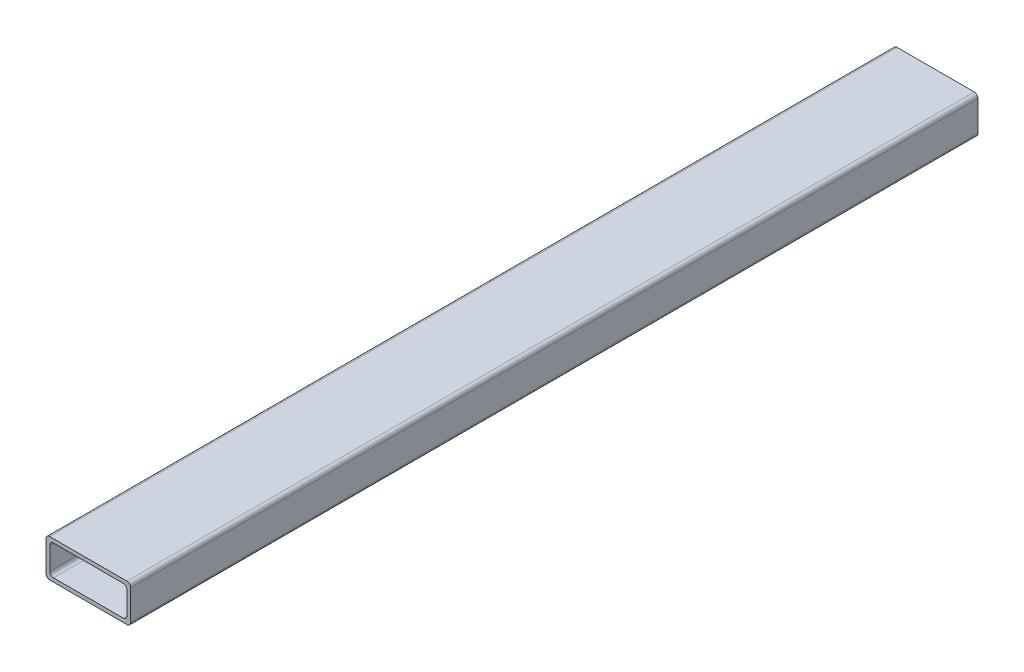
ISO-10303-21;
HEADER;
FILE_DESCRIPTION(('STEP AP214'),'2;1');
FILE_NAME('part.step','',(''),(''),'','','');
FILE_SCHEMA(('AUTOMOTIVE_DESIGN { 1 0 10303 214 1 1 1 1 }'));
ENDSEC;
DATA;
#1=APPLICATION_CONTEXT('core data for automotive mechanical design processes');
#2=APPLICATION_PROTOCOL_DEFINITION('international standard','automotive_design',2000,#1);
#3=PRODUCT_CONTEXT('',#1,'mechanical');
#4=PRODUCT('Part','Part','',(#3));
#5=PRODUCT_RELATED_PRODUCT_CATEGORY('part','',(#4));
#6=PRODUCT_DEFINITION_FORMATION('','',#4);
#7=PRODUCT_DEFINITION_CONTEXT('part definition',#1,'design');
#8=PRODUCT_DEFINITION('design','',#6,#7);
#9=PRODUCT_DEFINITION_SHAPE('','',#8);
#10=(LENGTH_UNIT() NAMED_UNIT(*) SI_UNIT(.MILLI.,.METRE.));
#11=(NAMED_UNIT(*) PLANE_ANGLE_UNIT() SI_UNIT($,.RADIAN.));
#12=(NAMED_UNIT(*) SI_UNIT($,.STERADIAN.) SOLID_ANGLE_UNIT());
#13=UNCERTAINTY_MEASURE_WITH_UNIT(LENGTH_MEASURE(1.E-05),#10,'distance_accuracy_value','');
#14=(GEOMETRIC_REPRESENTATION_CONTEXT(3) GLOBAL_UNCERTAINTY_ASSIGNED_CONTEXT((#13)) GLOBAL_UNIT_ASSIGNED_CONTEXT((#10,
#11,#12)) REPRESENTATION_CONTEXT('',''));
#15=CARTESIAN_POINT('',(0.,0.,0.));
#16=DIRECTION('',(0.,0.,1.));
#17=DIRECTION('',(1.,0.,0.));
#18=AXIS2_PLACEMENT_3D('',#15,#16,#17);
#19=CARTESIAN_POINT('',(-67.0781194232168,25.7326253085691,450.));
#20=DIRECTION('',(0.,0.,1.));
#21=DIRECTION('',(1.,0.,0.));
#22=AXIS2_PLACEMENT_3D('',#19,#20,#21);
#23=PLANE('',#22);
#24=CARTESIAN_POINT('',(-67.0781194232168,25.7326253085691,450.));
#25=DIRECTION('',(0.,0.,1.));
#26=DIRECTION('',(1.,0.,0.));
#27=AXIS2_PLACEMENT_3D('',#24,#25,#26);
#28=CIRCLE('',#27,2.);
#29=CARTESIAN_POINT('',(-67.0781194232168,27.7326253085691,450.));
#30=VERTEX_POINT('',#29);
#31=CARTESIAN_POINT('',(-69.0781194232168,25.7326253085691,450.));
#32=VERTEX_POINT('',#31);
#33=EDGE_CURVE('E195',#30,#32,#28,.T.);
#34=ORIENTED_EDGE('',*,*,#33,.T.);
#35=DIRECTION('',(0.,-1.,0.));
#36=VECTOR('',#35,1.);
#37=CARTESIAN_POINT('',(-69.0781194232168,9.73262530856907,450.));
#38=LINE('',#37,#36);
#39=CARTESIAN_POINT('',(-69.0781194232168,9.73262530856907,450.));
#40=VERTEX_POINT('',#39);
#41=EDGE_CURVE('E198',#32,#40,#38,.T.);
#42=ORIENTED_EDGE('',*,*,#41,.T.);
#43=CARTESIAN_POINT('',(-67.0781194232168,9.73262530856905,450.));
#44=DIRECTION('',(0.,0.,1.));
#45=DIRECTION('',(1.,0.,0.));
#46=AXIS2_PLACEMENT_3D('',#43,#44,#45);
#47=CIRCLE('',#46,2.);
#48=CARTESIAN_POINT('',(-67.0781194232168,7.73262530856905,450.));
#49=VERTEX_POINT('',#48);
#50=EDGE_CURVE('E201',#40,#49,#47,.T.);
#51=ORIENTED_EDGE('',*,*,#50,.T.);
#52=DIRECTION('',(1.,0.,0.));
#53=VECTOR('',#52,1.);
#54=CARTESIAN_POINT('',(-67.0781194232168,7.73262530856905,450.));
#55=LINE('',#54,#53);
#56=CARTESIAN_POINT('',(-26.0781194232168,7.73262530856905,450.));
#57=VERTEX_POINT('',#56);
#58=EDGE_CURVE('E203',#49,#57,#55,.T.);
#59=ORIENTED_EDGE('',*,*,#58,.T.);
#60=CARTESIAN_POINT('',(-26.0781194232168,9.73262530856905,450.));
#61=DIRECTION('',(0.,0.,1.));
#62=DIRECTION('',(1.,0.,0.));
#63=AXIS2_PLACEMENT_3D('',#60,#61,#62);
#64=CIRCLE('',#63,2.);
#65=CARTESIAN_POINT('',(-24.0781194232168,9.73262530856907,450.));
#66=VERTEX_POINT('',#65);
#67=EDGE_CURVE('E205',#57,#66,#64,.T.);
#68=ORIENTED_EDGE('',*,*,#67,.T.);
#69=DIRECTION('',(0.,1.,0.));
#70=VECTOR('',#69,1.);
#71=CARTESIAN_POINT('',(-24.0781194232168,25.7326253085691,450.));
#72=LINE('',#71,#70);
#73=CARTESIAN_POINT('',(-24.0781194232168,25.7326253085691,450.));
#74=VERTEX_POINT('',#73);
#75=EDGE_CURVE('E207',#66,#74,#72,.T.);
#76=ORIENTED_EDGE('',*,*,#75,.T.);
#77=CARTESIAN_POINT('',(-26.0781194232168,25.7326253085691,450.));
#78=DIRECTION('',(0.,0.,1.));
#79=DIRECTION('',(1.,0.,0.));
#80=AXIS2_PLACEMENT_3D('',#77,#78,#79);
#81=CIRCLE('',#80,2.);
#82=CARTESIAN_POINT('',(-26.0781194232168,27.7326253085691,450.));
#83=VERTEX_POINT('',#82);
#84=EDGE_CURVE('E209',#74,#83,#81,.T.);
#85=ORIENTED_EDGE('',*,*,#84,.T.);
#86=DIRECTION('',(-1.,0.,0.));
#87=VECTOR('',#86,1.);
#88=CARTESIAN_POINT('',(-67.0781194232168,27.7326253085691,450.));
#89=LINE('',#88,#87);
#90=EDGE_CURVE('E211',#83,#30,#89,.T.);
#91=ORIENTED_EDGE('',*,*,#90,.T.);
#92=EDGE_LOOP('',(#34,#42,#51,#59,#68,#76,#85,#91));
#93=FACE_BOUND('',#92,.T.);
#94=DIRECTION('',(0.,-1.,0.));
#95=VECTOR('',#94,1.);
#96=CARTESIAN_POINT('',(-67.0781194232168,11.7326253085691,450.));
#97=LINE('',#96,#95);
#98=CARTESIAN_POINT('',(-67.0781194232168,23.7326253085691,450.));
#99=VERTEX_POINT('',#98);
#100=CARTESIAN_POINT('',(-67.0781194232168,11.7326253085691,450.));
#101=VERTEX_POINT('',#100);
#102=EDGE_CURVE('E138',#99,#101,#97,.T.);
#103=ORIENTED_EDGE('',*,*,#102,.F.);
#104=CARTESIAN_POINT('',(-65.0781194232168,23.7326253085691,450.));
#105=DIRECTION('',(0.,0.,1.));
#106=DIRECTION('',(1.,0.,0.));
#107=AXIS2_PLACEMENT_3D('',#104,#105,#106);
#108=CIRCLE('',#107,2.);
#109=CARTESIAN_POINT('',(-65.0781194232168,25.7326253085691,450.));
#110=VERTEX_POINT('',#109);
#111=EDGE_CURVE('E130',#110,#99,#108,.T.);
#112=ORIENTED_EDGE('',*,*,#111,.F.);
#113=DIRECTION('',(-1.,0.,0.));
#114=VECTOR('',#113,1.);
#115=CARTESIAN_POINT('',(-65.0781194232168,25.7326253085691,450.));
#116=LINE('',#115,#114);
#117=CARTESIAN_POINT('',(-28.0781194232168,25.7326253085691,450.));
#118=VERTEX_POINT('',#117);
#119=EDGE_CURVE('E163',#118,#110,#116,.T.);
#120=ORIENTED_EDGE('',*,*,#119,.F.);
#121=CARTESIAN_POINT('',(-28.0781194232168,23.7326253085691,450.));
#122=DIRECTION('',(0.,0.,1.));
#123=DIRECTION('',(1.,0.,0.));
#124=AXIS2_PLACEMENT_3D('',#121,#122,#123);
#125=CIRCLE('',#124,2.);
#126=CARTESIAN_POINT('',(-26.0781194232168,23.7326253085691,450.));
#127=VERTEX_POINT('',#126);
#128=EDGE_CURVE('E161',#127,#118,#125,.T.);
#129=ORIENTED_EDGE('',*,*,#128,.F.);
#130=DIRECTION('',(0.,1.,0.));
#131=VECTOR('',#130,1.);
#132=CARTESIAN_POINT('',(-26.0781194232168,23.7326253085691,450.));
#133=LINE('',#132,#131);
#134=CARTESIAN_POINT('',(-26.0781194232168,11.7326253085691,450.));
#135=VERTEX_POINT('',#134);
#136=EDGE_CURVE('E159',#135,#127,#133,.T.);
#137=ORIENTED_EDGE('',*,*,#136,.F.);
#138=CARTESIAN_POINT('',(-28.0781194232168,11.732625308569,450.));
#139=DIRECTION('',(0.,0.,1.));
#140=DIRECTION('',(1.,0.,0.));
#141=AXIS2_PLACEMENT_3D('',#138,#139,#140);
#142=CIRCLE('',#141,2.);
#143=CARTESIAN_POINT('',(-28.0781194232168,9.73262530856905,450.));
#144=VERTEX_POINT('',#143);
#145=EDGE_CURVE('E157',#144,#135,#142,.T.);
#146=ORIENTED_EDGE('',*,*,#145,.F.);
#147=DIRECTION('',(1.,0.,0.));
#148=VECTOR('',#147,1.);
#149=CARTESIAN_POINT('',(-65.0781194232168,9.73262530856905,450.));
#150=LINE('',#149,#148);
#151=CARTESIAN_POINT('',(-65.0781194232168,9.73262530856905,450.));
#152=VERTEX_POINT('',#151);
#153=EDGE_CURVE('E153',#152,#144,#150,.T.);
#154=ORIENTED_EDGE('',*,*,#153,.F.);
#155=CARTESIAN_POINT('',(-65.0781194232168,11.732625308569,450.));
#156=DIRECTION('',(0.,0.,1.));
#157=DIRECTION('',(1.,0.,0.));
#158=AXIS2_PLACEMENT_3D('',#155,#156,#157);
#159=CIRCLE('',#158,2.);
#160=EDGE_CURVE('E151',#101,#152,#159,.T.);
#161=ORIENTED_EDGE('',*,*,#160,.F.);
#162=EDGE_LOOP('',(#103,#112,#120,#129,#137,#146,#154,#161));
#163=FACE_BOUND('',#162,.T.);
#164=ADVANCED_FACE('F17',(#93,#163),#23,.T.);
#165=CARTESIAN_POINT('',(-67.0781194232168,25.7326253085691,0.));
#166=DIRECTION('',(0.,0.,1.));
#167=DIRECTION('',(1.,0.,0.));
#168=AXIS2_PLACEMENT_3D('',#165,#166,#167);
#169=PLANE('',#168);
#170=CARTESIAN_POINT('',(-67.0781194232168,25.7326253085691,0.));
#171=DIRECTION('',(0.,0.,1.));
#172=DIRECTION('',(1.,0.,0.));
#173=AXIS2_PLACEMENT_3D('',#170,#171,#172);
#174=CIRCLE('',#173,2.);
#175=CARTESIAN_POINT('',(-67.0781194232168,27.7326253085691,0.));
#176=VERTEX_POINT('',#175);
#177=CARTESIAN_POINT('',(-69.0781194232168,25.7326253085691,0.));
#178=VERTEX_POINT('',#177);
#179=EDGE_CURVE('E146',#176,#178,#174,.T.);
#180=ORIENTED_EDGE('',*,*,#179,.F.);
#181=DIRECTION('',(-1.,0.,0.));
#182=VECTOR('',#181,1.);
#183=CARTESIAN_POINT('',(-67.0781194232168,27.7326253085691,0.));
#184=LINE('',#183,#182);
#185=CARTESIAN_POINT('',(-26.0781194232168,27.7326253085691,0.));
#186=VERTEX_POINT('',#185);
#187=EDGE_CURVE('E199',#186,#176,#184,.T.);
#188=ORIENTED_EDGE('',*,*,#187,.F.);
#189=CARTESIAN_POINT('',(-26.0781194232168,25.7326253085691,0.));
#190=DIRECTION('',(0.,0.,1.));
#191=DIRECTION('',(1.,0.,0.));
#192=AXIS2_PLACEMENT_3D('',#189,#190,#191);
#193=CIRCLE('',#192,2.);
#194=CARTESIAN_POINT('',(-24.0781194232168,25.7326253085691,0.));
#195=VERTEX_POINT('',#194);
#196=EDGE_CURVE('E226',#195,#186,#193,.T.);
#197=ORIENTED_EDGE('',*,*,#196,.F.);
#198=DIRECTION('',(0.,1.,0.));
#199=VECTOR('',#198,1.);
#200=CARTESIAN_POINT('',(-24.0781194232168,25.7326253085691,0.));
#201=LINE('',#200,#199);
#202=CARTESIAN_POINT('',(-24.0781194232168,9.73262530856907,0.));
#203=VERTEX_POINT('',#202);
#204=EDGE_CURVE('E224',#203,#195,#201,.T.);
#205=ORIENTED_EDGE('',*,*,#204,.F.);
#206=CARTESIAN_POINT('',(-26.0781194232168,9.73262530856905,0.));
#207=DIRECTION('',(0.,0.,1.));
#208=DIRECTION('',(1.,0.,0.));
#209=AXIS2_PLACEMENT_3D('',#206,#207,#208);
#210=CIRCLE('',#209,2.);
#211=CARTESIAN_POINT('',(-26.0781194232168,7.73262530856905,0.));
#212=VERTEX_POINT('',#211);
#213=EDGE_CURVE('E222',#212,#203,#210,.T.);
#214=ORIENTED_EDGE('',*,*,#213,.F.);
#215=DIRECTION('',(1.,0.,0.));
#216=VECTOR('',#215,1.);
#217=CARTESIAN_POINT('',(-67.0781194232168,7.73262530856905,0.));
#218=LINE('',#217,#216);
#219=CARTESIAN_POINT('',(-67.0781194232168,7.73262530856905,0.));
#220=VERTEX_POINT('',#219);
#221=EDGE_CURVE('E220',#220,#212,#218,.T.);
#222=ORIENTED_EDGE('',*,*,#221,.F.);
#223=CARTESIAN_POINT('',(-67.0781194232168,9.73262530856905,0.));
#224=DIRECTION('',(0.,0.,1.));
#225=DIRECTION('',(1.,0.,0.));
#226=AXIS2_PLACEMENT_3D('',#223,#224,#225);
#227=CIRCLE('',#226,2.);
#228=CARTESIAN_POINT('',(-69.0781194232168,9.73262530856907,0.));
#229=VERTEX_POINT('',#228);
#230=EDGE_CURVE('E218',#229,#220,#227,.T.);
#231=ORIENTED_EDGE('',*,*,#230,.F.);
#232=DIRECTION('',(0.,-1.,0.));
#233=VECTOR('',#232,1.);
#234=CARTESIAN_POINT('',(-69.0781194232168,9.73262530856907,0.));
#235=LINE('',#234,#233);
#236=EDGE_CURVE('E216',#178,#229,#235,.T.);
#237=ORIENTED_EDGE('',*,*,#236,.F.);
#238=EDGE_LOOP('',(#180,#188,#197,#205,#214,#222,#231,#237));
#239=FACE_BOUND('',#238,.T.);
#240=CARTESIAN_POINT('',(-65.0781194232168,23.7326253085691,0.));
#241=DIRECTION('',(0.,0.,1.));
#242=DIRECTION('',(1.,0.,0.));
#243=AXIS2_PLACEMENT_3D('',#240,#241,#242);
#244=CIRCLE('',#243,2.);
#245=CARTESIAN_POINT('',(-65.0781194232168,25.7326253085691,0.));
#246=VERTEX_POINT('',#245);
#247=CARTESIAN_POINT('',(-67.0781194232168,23.7326253085691,0.));
#248=VERTEX_POINT('',#247);
#249=EDGE_CURVE('E40',#246,#248,#244,.T.);
#250=ORIENTED_EDGE('',*,*,#249,.T.);
#251=DIRECTION('',(0.,-1.,0.));
#252=VECTOR('',#251,1.);
#253=CARTESIAN_POINT('',(-67.0781194232168,11.7326253085691,0.));
#254=LINE('',#253,#252);
#255=CARTESIAN_POINT('',(-67.0781194232168,11.7326253085691,0.));
#256=VERTEX_POINT('',#255);
#257=EDGE_CURVE('E145',#248,#256,#254,.T.);
#258=ORIENTED_EDGE('',*,*,#257,.T.);
#259=CARTESIAN_POINT('',(-65.0781194232168,11.732625308569,0.));
#260=DIRECTION('',(0.,0.,1.));
#261=DIRECTION('',(1.,0.,0.));
#262=AXIS2_PLACEMENT_3D('',#259,#260,#261);
#263=CIRCLE('',#262,2.);
#264=CARTESIAN_POINT('',(-65.0781194232168,9.73262530856905,0.));
#265=VERTEX_POINT('',#264);
#266=EDGE_CURVE('E167',#256,#265,#263,.T.);
#267=ORIENTED_EDGE('',*,*,#266,.T.);
#268=DIRECTION('',(1.,0.,0.));
#269=VECTOR('',#268,1.);
#270=CARTESIAN_POINT('',(-65.0781194232168,9.73262530856905,0.));
#271=LINE('',#270,#269);
#272=CARTESIAN_POINT('',(-28.0781194232168,9.73262530856905,0.));
#273=VERTEX_POINT('',#272);
#274=EDGE_CURVE('E170',#265,#273,#271,.T.);
#275=ORIENTED_EDGE('',*,*,#274,.T.);
#276=CARTESIAN_POINT('',(-28.0781194232168,11.732625308569,0.));
#277=DIRECTION('',(0.,0.,1.));
#278=DIRECTION('',(1.,0.,0.));
#279=AXIS2_PLACEMENT_3D('',#276,#277,#278);
#280=CIRCLE('',#279,2.);
#281=CARTESIAN_POINT('',(-26.0781194232168,11.7326253085691,0.));
#282=VERTEX_POINT('',#281);
#283=EDGE_CURVE('E173',#273,#282,#280,.T.);
#284=ORIENTED_EDGE('',*,*,#283,.T.);
#285=DIRECTION('',(0.,1.,0.));
#286=VECTOR('',#285,1.);
#287=CARTESIAN_POINT('',(-26.0781194232168,23.7326253085691,0.));
#288=LINE('',#287,#286);
#289=CARTESIAN_POINT('',(-26.0781194232168,23.7326253085691,0.));
#290=VERTEX_POINT('',#289);
#291=EDGE_CURVE('E176',#282,#290,#288,.T.);
#292=ORIENTED_EDGE('',*,*,#291,.T.);
#293=CARTESIAN_POINT('',(-28.0781194232168,23.7326253085691,0.));
#294=DIRECTION('',(0.,0.,1.));
#295=DIRECTION('',(1.,0.,0.));
#296=AXIS2_PLACEMENT_3D('',#293,#294,#295);
#297=CIRCLE('',#296,2.);
#298=CARTESIAN_POINT('',(-28.0781194232168,25.7326253085691,0.));
#299=VERTEX_POINT('',#298);
#300=EDGE_CURVE('E179',#290,#299,#297,.T.);
#301=ORIENTED_EDGE('',*,*,#300,.T.);
#302=DIRECTION('',(-1.,0.,0.));
#303=VECTOR('',#302,1.);
#304=CARTESIAN_POINT('',(-65.0781194232168,25.7326253085691,0.));
#305=LINE('',#304,#303);
#306=EDGE_CURVE('E139',#299,#246,#305,.T.);
#307=ORIENTED_EDGE('',*,*,#306,.T.);
#308=EDGE_LOOP('',(#250,#258,#267,#275,#284,#292,#301,#307));
#309=FACE_BOUND('',#308,.T.);
#310=ADVANCED_FACE('F256',(#239,#309),#169,.F.);
#311=CARTESIAN_POINT('',(-67.0781194232168,25.7326253085691,450.));
#312=DIRECTION('',(0.,0.,-1.));
#313=DIRECTION('',(-1.,0.,0.));
#314=AXIS2_PLACEMENT_3D('',#311,#312,#313);
#315=CYLINDRICAL_SURFACE('',#314,2.);
#316=ORIENTED_EDGE('',*,*,#179,.T.);
#317=DIRECTION('',(0.,0.,-1.));
#318=VECTOR('',#317,1.);
#319=CARTESIAN_POINT('',(-69.0781194232168,25.7326253085691,450.));
#320=LINE('',#319,#318);
#321=EDGE_CURVE('E11',#32,#178,#320,.T.);
#322=ORIENTED_EDGE('',*,*,#321,.F.);
#323=ORIENTED_EDGE('',*,*,#33,.F.);
#324=DIRECTION('',(0.,0.,-1.));
#325=VECTOR('',#324,1.);
#326=CARTESIAN_POINT('',(-67.0781194232168,27.7326253085691,450.));
#327=LINE('',#326,#325);
#328=EDGE_CURVE('E213',#30,#176,#327,.T.);
#329=ORIENTED_EDGE('',*,*,#328,.T.);
#330=EDGE_LOOP('',(#316,#322,#323,#329));
#331=FACE_BOUND('',#330,.T.);
#332=ADVANCED_FACE('F19',(#331),#315,.T.);
#333=CARTESIAN_POINT('',(-69.0781194232168,9.73262530856907,450.));
#334=DIRECTION('',(1.,0.,0.));
#335=DIRECTION('',(0.,0.,-1.));
#336=AXIS2_PLACEMENT_3D('',#333,#334,#335);
#337=PLANE('',#336);
#338=ORIENTED_EDGE('',*,*,#236,.T.);
#339=DIRECTION('',(0.,0.,-1.));
#340=VECTOR('',#339,1.);
#341=CARTESIAN_POINT('',(-69.0781194232168,9.73262530856907,450.));
#342=LINE('',#341,#340);
#343=EDGE_CURVE('E25',#40,#229,#342,.T.);
#344=ORIENTED_EDGE('',*,*,#343,.F.);
#345=ORIENTED_EDGE('',*,*,#41,.F.);
#346=ORIENTED_EDGE('',*,*,#321,.T.);
#347=EDGE_LOOP('',(#338,#344,#345,#346));
#348=FACE_BOUND('',#347,.T.);
#349=ADVANCED_FACE('F273',(#348),#337,.F.);
#350=CARTESIAN_POINT('',(-67.0781194232168,9.73262530856905,450.));
#351=DIRECTION('',(0.,0.,-1.));
#352=DIRECTION('',(-1.,0.,0.));
#353=AXIS2_PLACEMENT_3D('',#350,#351,#352);
#354=CYLINDRICAL_SURFACE('',#353,2.);
#355=ORIENTED_EDGE('',*,*,#230,.T.);
#356=DIRECTION('',(0.,0.,-1.));
#357=VECTOR('',#356,1.);
#358=CARTESIAN_POINT('',(-67.0781194232168,7.73262530856905,450.));
#359=LINE('',#358,#357);
#360=EDGE_CURVE('E243',#49,#220,#359,.T.);
#361=ORIENTED_EDGE('',*,*,#360,.F.);
#362=ORIENTED_EDGE('',*,*,#50,.F.);
#363=ORIENTED_EDGE('',*,*,#343,.T.);
#364=EDGE_LOOP('',(#355,#361,#362,#363));
#365=FACE_BOUND('',#364,.T.);
#366=ADVANCED_FACE('F250',(#365),#354,.T.);
#367=CARTESIAN_POINT('',(-67.0781194232168,7.73262530856905,450.));
#368=DIRECTION('',(0.,1.,0.));
#369=DIRECTION('',(0.,0.,1.));
#370=AXIS2_PLACEMENT_3D('',#367,#368,#369);
#371=PLANE('',#370);
#372=ORIENTED_EDGE('',*,*,#221,.T.);
#373=DIRECTION('',(0.,0.,-1.));
#374=VECTOR('',#373,1.);
#375=CARTESIAN_POINT('',(-26.0781194232168,7.73262530856905,450.));
#376=LINE('',#375,#374);
#377=EDGE_CURVE('E240',#57,#212,#376,.T.);
#378=ORIENTED_EDGE('',*,*,#377,.F.);
#379=ORIENTED_EDGE('',*,*,#58,.F.);
#380=ORIENTED_EDGE('',*,*,#360,.T.);
#381=EDGE_LOOP('',(#372,#378,#379,#380));
#382=FACE_BOUND('',#381,.T.);
#383=ADVANCED_FACE('F262',(#382),#371,.F.);
#384=CARTESIAN_POINT('',(-26.0781194232168,9.73262530856905,450.));
#385=DIRECTION('',(0.,0.,-1.));
#386=DIRECTION('',(-1.,0.,0.));
#387=AXIS2_PLACEMENT_3D('',#384,#385,#386);
#388=CYLINDRICAL_SURFACE('',#387,2.);
#389=ORIENTED_EDGE('',*,*,#213,.T.);
#390=DIRECTION('',(0.,0.,-1.));
#391=VECTOR('',#390,1.);
#392=CARTESIAN_POINT('',(-24.0781194232168,9.73262530856907,450.));
#393=LINE('',#392,#391);
#394=EDGE_CURVE('E237',#66,#203,#393,.T.);
#395=ORIENTED_EDGE('',*,*,#394,.F.);
#396=ORIENTED_EDGE('',*,*,#67,.F.);
#397=ORIENTED_EDGE('',*,*,#377,.T.);
#398=EDGE_LOOP('',(#389,#395,#396,#397));
#399=FACE_BOUND('',#398,.T.);
#400=ADVANCED_FACE('F266',(#399),#388,.T.);
#401=CARTESIAN_POINT('',(-24.0781194232168,25.7326253085691,450.));
#402=DIRECTION('',(-1.,0.,0.));
#403=DIRECTION('',(0.,0.,1.));
#404=AXIS2_PLACEMENT_3D('',#401,#402,#403);
#405=PLANE('',#404);
#406=ORIENTED_EDGE('',*,*,#204,.T.);
#407=DIRECTION('',(0.,0.,-1.));
#408=VECTOR('',#407,1.);
#409=CARTESIAN_POINT('',(-24.0781194232168,25.7326253085691,450.));
#410=LINE('',#409,#408);
#411=EDGE_CURVE('E234',#74,#195,#410,.T.);
#412=ORIENTED_EDGE('',*,*,#411,.F.);
#413=ORIENTED_EDGE('',*,*,#75,.F.);
#414=ORIENTED_EDGE('',*,*,#394,.T.);
#415=EDGE_LOOP('',(#406,#412,#413,#414));
#416=FACE_BOUND('',#415,.T.);
#417=ADVANCED_FACE('F286',(#416),#405,.F.);
#418=CARTESIAN_POINT('',(-26.0781194232168,25.7326253085691,450.));
#419=DIRECTION('',(0.,0.,-1.));
#420=DIRECTION('',(-1.,0.,0.));
#421=AXIS2_PLACEMENT_3D('',#418,#419,#420);
#422=CYLINDRICAL_SURFACE('',#421,2.);
#423=ORIENTED_EDGE('',*,*,#196,.T.);
#424=DIRECTION('',(0.,0.,-1.));
#425=VECTOR('',#424,1.);
#426=CARTESIAN_POINT('',(-26.0781194232168,27.7326253085691,450.));
#427=LINE('',#426,#425);
#428=EDGE_CURVE('E231',#83,#186,#427,.T.);
#429=ORIENTED_EDGE('',*,*,#428,.F.);
#430=ORIENTED_EDGE('',*,*,#84,.F.);
#431=ORIENTED_EDGE('',*,*,#411,.T.);
#432=EDGE_LOOP('',(#423,#429,#430,#431));
#433=FACE_BOUND('',#432,.T.);
#434=ADVANCED_FACE('F284',(#433),#422,.T.);
#435=CARTESIAN_POINT('',(-67.0781194232168,27.7326253085691,450.));
#436=DIRECTION('',(0.,-1.,0.));
#437=DIRECTION('',(0.,0.,-1.));
#438=AXIS2_PLACEMENT_3D('',#435,#436,#437);
#439=PLANE('',#438);
#440=ORIENTED_EDGE('',*,*,#187,.T.);
#441=ORIENTED_EDGE('',*,*,#328,.F.);
#442=ORIENTED_EDGE('',*,*,#90,.F.);
#443=ORIENTED_EDGE('',*,*,#428,.T.);
#444=EDGE_LOOP('',(#440,#441,#442,#443));
#445=FACE_BOUND('',#444,.T.);
#446=ADVANCED_FACE('F279',(#445),#439,.F.);
#447=CARTESIAN_POINT('',(-65.0781194232168,23.7326253085691,450.));
#448=DIRECTION('',(0.,0.,-1.));
#449=DIRECTION('',(-1.,0.,0.));
#450=AXIS2_PLACEMENT_3D('',#447,#448,#449);
#451=CYLINDRICAL_SURFACE('',#450,2.);
#452=ORIENTED_EDGE('',*,*,#249,.F.);
#453=DIRECTION('',(0.,0.,-1.));
#454=VECTOR('',#453,1.);
#455=CARTESIAN_POINT('',(-65.0781194232168,25.7326253085691,450.));
#456=LINE('',#455,#454);
#457=EDGE_CURVE('E134',#110,#246,#456,.T.);
#458=ORIENTED_EDGE('',*,*,#457,.F.);
#459=ORIENTED_EDGE('',*,*,#111,.T.);
#460=DIRECTION('',(0.,0.,-1.));
#461=VECTOR('',#460,1.);
#462=CARTESIAN_POINT('',(-67.0781194232168,23.7326253085691,450.));
#463=LINE('',#462,#461);
#464=EDGE_CURVE('E133',#99,#248,#463,.T.);
#465=ORIENTED_EDGE('',*,*,#464,.T.);
#466=EDGE_LOOP('',(#452,#458,#459,#465));
#467=FACE_BOUND('',#466,.T.);
#468=ADVANCED_FACE('F132',(#467),#451,.F.);
#469=CARTESIAN_POINT('',(-67.0781194232168,11.7326253085691,450.));
#470=DIRECTION('',(1.,0.,0.));
#471=DIRECTION('',(0.,0.,-1.));
#472=AXIS2_PLACEMENT_3D('',#469,#470,#471);
#473=PLANE('',#472);
#474=ORIENTED_EDGE('',*,*,#257,.F.);
#475=ORIENTED_EDGE('',*,*,#464,.F.);
#476=ORIENTED_EDGE('',*,*,#102,.T.);
#477=DIRECTION('',(0.,0.,-1.));
#478=VECTOR('',#477,1.);
#479=CARTESIAN_POINT('',(-67.0781194232168,11.7326253085691,450.));
#480=LINE('',#479,#478);
#481=EDGE_CURVE('E147',#101,#256,#480,.T.);
#482=ORIENTED_EDGE('',*,*,#481,.T.);
#483=EDGE_LOOP('',(#474,#475,#476,#482));
#484=FACE_BOUND('',#483,.T.);
#485=ADVANCED_FACE('F142',(#484),#473,.T.);
#486=CARTESIAN_POINT('',(-65.0781194232168,11.732625308569,450.));
#487=DIRECTION('',(0.,0.,-1.));
#488=DIRECTION('',(-1.,0.,0.));
#489=AXIS2_PLACEMENT_3D('',#486,#487,#488);
#490=CYLINDRICAL_SURFACE('',#489,2.);
#491=ORIENTED_EDGE('',*,*,#266,.F.);
#492=ORIENTED_EDGE('',*,*,#481,.F.);
#493=ORIENTED_EDGE('',*,*,#160,.T.);
#494=DIRECTION('',(0.,0.,-1.));
#495=VECTOR('',#494,1.);
#496=CARTESIAN_POINT('',(-65.0781194232168,9.73262530856905,450.));
#497=LINE('',#496,#495);
#498=EDGE_CURVE('E192',#152,#265,#497,.T.);
#499=ORIENTED_EDGE('',*,*,#498,.T.);
#500=EDGE_LOOP('',(#491,#492,#493,#499));
#501=FACE_BOUND('',#500,.T.);
#502=ADVANCED_FACE('F316',(#501),#490,.F.);
#503=CARTESIAN_POINT('',(-65.0781194232168,9.73262530856905,450.));
#504=DIRECTION('',(0.,1.,0.));
#505=DIRECTION('',(0.,0.,1.));
#506=AXIS2_PLACEMENT_3D('',#503,#504,#505);
#507=PLANE('',#506);
#508=ORIENTED_EDGE('',*,*,#274,.F.);
#509=ORIENTED_EDGE('',*,*,#498,.F.);
#510=ORIENTED_EDGE('',*,*,#153,.T.);
#511=DIRECTION('',(0.,0.,-1.));
#512=VECTOR('',#511,1.);
#513=CARTESIAN_POINT('',(-28.0781194232168,9.73262530856905,450.));
#514=LINE('',#513,#512);
#515=EDGE_CURVE('E190',#144,#273,#514,.T.);
#516=ORIENTED_EDGE('',*,*,#515,.T.);
#517=EDGE_LOOP('',(#508,#509,#510,#516));
#518=FACE_BOUND('',#517,.T.);
#519=ADVANCED_FACE('F321',(#518),#507,.T.);
#520=CARTESIAN_POINT('',(-28.0781194232168,11.732625308569,450.));
#521=DIRECTION('',(0.,0.,-1.));
#522=DIRECTION('',(-1.,0.,0.));
#523=AXIS2_PLACEMENT_3D('',#520,#521,#522);
#524=CYLINDRICAL_SURFACE('',#523,2.);
#525=ORIENTED_EDGE('',*,*,#283,.F.);
#526=ORIENTED_EDGE('',*,*,#515,.F.);
#527=ORIENTED_EDGE('',*,*,#145,.T.);
#528=DIRECTION('',(0.,0.,-1.));
#529=VECTOR('',#528,1.);
#530=CARTESIAN_POINT('',(-26.0781194232168,11.7326253085691,450.));
#531=LINE('',#530,#529);
#532=EDGE_CURVE('E188',#135,#282,#531,.T.);
#533=ORIENTED_EDGE('',*,*,#532,.T.);
#534=EDGE_LOOP('',(#525,#526,#527,#533));
#535=FACE_BOUND('',#534,.T.);
#536=ADVANCED_FACE('F327',(#535),#524,.F.);
#537=CARTESIAN_POINT('',(-26.0781194232168,23.7326253085691,450.));
#538=DIRECTION('',(-1.,0.,0.));
#539=DIRECTION('',(0.,0.,1.));
#540=AXIS2_PLACEMENT_3D('',#537,#538,#539);
#541=PLANE('',#540);
#542=ORIENTED_EDGE('',*,*,#291,.F.);
#543=ORIENTED_EDGE('',*,*,#532,.F.);
#544=ORIENTED_EDGE('',*,*,#136,.T.);
#545=DIRECTION('',(0.,0.,-1.));
#546=VECTOR('',#545,1.);
#547=CARTESIAN_POINT('',(-26.0781194232168,23.7326253085691,450.));
#548=LINE('',#547,#546);
#549=EDGE_CURVE('E186',#127,#290,#548,.T.);
#550=ORIENTED_EDGE('',*,*,#549,.T.);
#551=EDGE_LOOP('',(#542,#543,#544,#550));
#552=FACE_BOUND('',#551,.T.);
#553=ADVANCED_FACE('F331',(#552),#541,.T.);
#554=CARTESIAN_POINT('',(-28.0781194232168,23.7326253085691,450.));
#555=DIRECTION('',(0.,0.,-1.));
#556=DIRECTION('',(-1.,0.,0.));
#557=AXIS2_PLACEMENT_3D('',#554,#555,#556);
#558=CYLINDRICAL_SURFACE('',#557,2.);
#559=ORIENTED_EDGE('',*,*,#300,.F.);
#560=ORIENTED_EDGE('',*,*,#549,.F.);
#561=ORIENTED_EDGE('',*,*,#128,.T.);
#562=DIRECTION('',(0.,0.,-1.));
#563=VECTOR('',#562,1.);
#564=CARTESIAN_POINT('',(-28.0781194232168,25.7326253085691,450.));
#565=LINE('',#564,#563);
#566=EDGE_CURVE('E32',#118,#299,#565,.T.);
#567=ORIENTED_EDGE('',*,*,#566,.T.);
#568=EDGE_LOOP('',(#559,#560,#561,#567));
#569=FACE_BOUND('',#568,.T.);
#570=ADVANCED_FACE('F335',(#569),#558,.F.);
#571=CARTESIAN_POINT('',(-65.0781194232168,25.7326253085691,450.));
#572=DIRECTION('',(0.,-1.,0.));
#573=DIRECTION('',(0.,0.,-1.));
#574=AXIS2_PLACEMENT_3D('',#571,#572,#573);
#575=PLANE('',#574);
#576=ORIENTED_EDGE('',*,*,#306,.F.);
#577=ORIENTED_EDGE('',*,*,#566,.F.);
#578=ORIENTED_EDGE('',*,*,#119,.T.);
#579=ORIENTED_EDGE('',*,*,#457,.T.);
#580=EDGE_LOOP('',(#576,#577,#578,#579));
#581=FACE_BOUND('',#580,.T.);
#582=ADVANCED_FACE('F339',(#581),#575,.T.);
#583=CLOSED_SHELL('',(#164,#310,#332,#349,#366,#383,#400,#417,#434,#446,#468,#485,#502,#519,
#536,#553,#570,#582));
#584=MANIFOLD_SOLID_BREP('B1',#583);
#585=ADVANCED_BREP_SHAPE_REPRESENTATION('',(#18,#584),#14);
#586=SHAPE_DEFINITION_REPRESENTATION(#9,#585);
ENDSEC;
END-ISO-10303-21;
